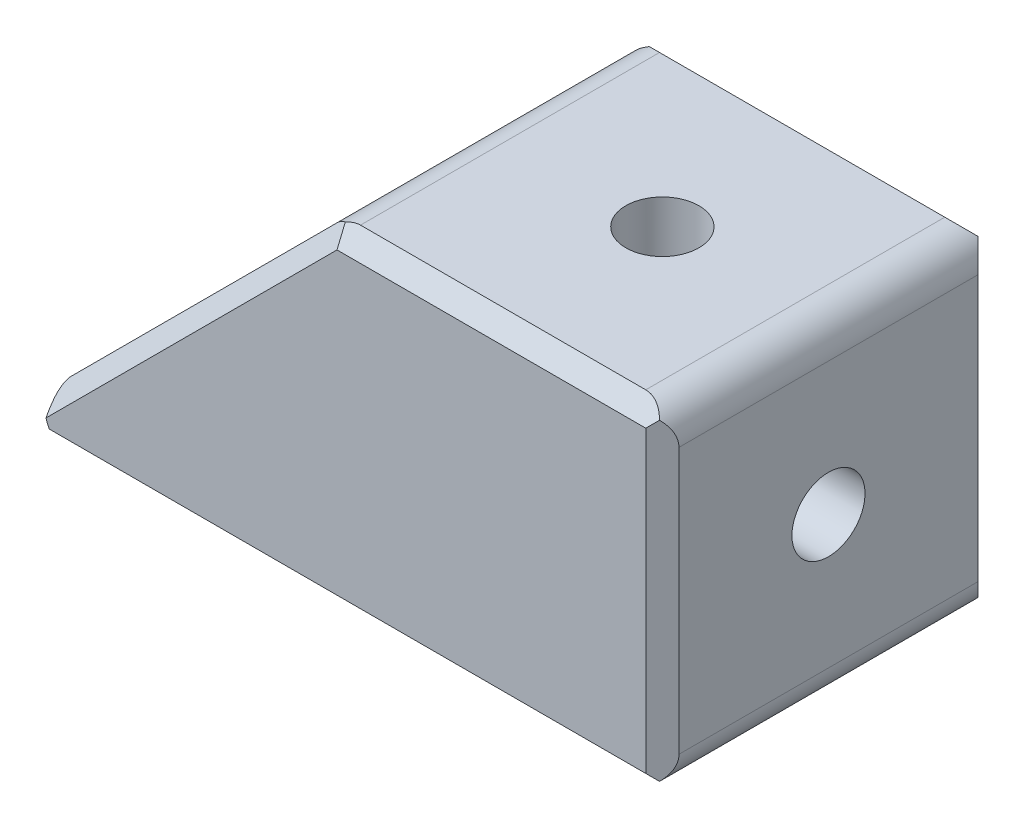
ISO-10303-21;
HEADER;
FILE_DESCRIPTION(('STEP AP214'),'2;1');
FILE_NAME('part.step','',(''),(''),'','','');
FILE_SCHEMA(('AUTOMOTIVE_DESIGN { 1 0 10303 214 1 1 1 1 }'));
ENDSEC;
DATA;
#1=APPLICATION_CONTEXT('core data for automotive mechanical design processes');
#2=APPLICATION_PROTOCOL_DEFINITION('international standard','automotive_design',2000,#1);
#3=PRODUCT_CONTEXT('',#1,'mechanical');
#4=PRODUCT('Part','Part','',(#3));
#5=PRODUCT_RELATED_PRODUCT_CATEGORY('part','',(#4));
#6=PRODUCT_DEFINITION_FORMATION('','',#4);
#7=PRODUCT_DEFINITION_CONTEXT('part definition',#1,'design');
#8=PRODUCT_DEFINITION('design','',#6,#7);
#9=PRODUCT_DEFINITION_SHAPE('','',#8);
#10=(LENGTH_UNIT() NAMED_UNIT(*) SI_UNIT(.MILLI.,.METRE.));
#11=(NAMED_UNIT(*) PLANE_ANGLE_UNIT() SI_UNIT($,.RADIAN.));
#12=(NAMED_UNIT(*) SI_UNIT($,.STERADIAN.) SOLID_ANGLE_UNIT());
#13=UNCERTAINTY_MEASURE_WITH_UNIT(LENGTH_MEASURE(1.E-05),#10,'distance_accuracy_value','');
#14=(GEOMETRIC_REPRESENTATION_CONTEXT(3) GLOBAL_UNCERTAINTY_ASSIGNED_CONTEXT((#13)) GLOBAL_UNIT_ASSIGNED_CONTEXT((#10,
#11,#12)) REPRESENTATION_CONTEXT('',''));
#15=CARTESIAN_POINT('',(0.,0.,0.));
#16=DIRECTION('',(0.,0.,1.));
#17=DIRECTION('',(1.,0.,0.));
#18=AXIS2_PLACEMENT_3D('',#15,#16,#17);
#19=CARTESIAN_POINT('',(0.,10.,10.));
#20=DIRECTION('',(-1.,0.,0.));
#21=DIRECTION('',(0.,0.,1.));
#22=AXIS2_PLACEMENT_3D('',#19,#20,#21);
#23=CYLINDRICAL_SURFACE('',#22,2.2);
#24=CARTESIAN_POINT('',(10.,10.,10.));
#25=DIRECTION('',(-0.707106781186547,0.707106781186547,0.));
#26=DIRECTION('',(-0.707106781186547,-0.707106781186547,0.));
#27=AXIS2_PLACEMENT_3D('',#24,#25,#26);
#28=ELLIPSE('',#27,3.1112698372208,2.2);
#29=CARTESIAN_POINT('',(10.,10.,12.2));
#30=VERTEX_POINT('',#29);
#31=CARTESIAN_POINT('',(10.,10.,7.8));
#32=VERTEX_POINT('',#31);
#33=EDGE_CURVE('E163',#30,#32,#28,.T.);
#34=ORIENTED_EDGE('',*,*,#33,.T.);
#35=CARTESIAN_POINT('',(10.,10.,10.));
#36=DIRECTION('',(-0.707106781186547,-0.707106781186547,0.));
#37=DIRECTION('',(-0.707106781186547,0.707106781186547,0.));
#38=AXIS2_PLACEMENT_3D('',#35,#36,#37);
#39=ELLIPSE('',#38,3.1112698372208,2.2);
#40=EDGE_CURVE('E170',#32,#30,#39,.T.);
#41=ORIENTED_EDGE('',*,*,#40,.T.);
#42=EDGE_LOOP('',(#34,#41));
#43=FACE_BOUND('',#42,.T.);
#44=CARTESIAN_POINT('',(30.,10.,10.));
#45=DIRECTION('',(-0.707106781186547,0.707106781186547,0.));
#46=DIRECTION('',(-0.707106781186547,-0.707106781186547,0.));
#47=AXIS2_PLACEMENT_3D('',#44,#45,#46);
#48=ELLIPSE('',#47,3.1112698372208,2.19999999999999);
#49=CARTESIAN_POINT('',(30.,10.,12.2));
#50=VERTEX_POINT('',#49);
#51=CARTESIAN_POINT('',(30.,10.,7.80000000000001));
#52=VERTEX_POINT('',#51);
#53=EDGE_CURVE('E399',#50,#52,#48,.F.);
#54=ORIENTED_EDGE('',*,*,#53,.T.);
#55=CARTESIAN_POINT('',(30.,10.,10.));
#56=DIRECTION('',(-0.707106781186547,-0.707106781186547,0.));
#57=DIRECTION('',(-0.707106781186547,0.707106781186547,0.));
#58=AXIS2_PLACEMENT_3D('',#55,#56,#57);
#59=ELLIPSE('',#58,3.1112698372208,2.19999999999999);
#60=EDGE_CURVE('E174',#52,#50,#59,.F.);
#61=ORIENTED_EDGE('',*,*,#60,.T.);
#62=EDGE_LOOP('',(#54,#61));
#63=FACE_BOUND('',#62,.T.);
#64=ADVANCED_FACE('F39',(#43,#63),#23,.F.);
#65=CARTESIAN_POINT('',(0.,0.,20.));
#66=DIRECTION('',(0.,1.,0.));
#67=DIRECTION('',(0.,0.,1.));
#68=AXIS2_PLACEMENT_3D('',#65,#66,#67);
#69=PLANE('',#68);
#70=CARTESIAN_POINT('',(10.,0.,10.));
#71=DIRECTION('',(0.,-1.,0.));
#72=DIRECTION('',(0.,0.,-1.));
#73=AXIS2_PLACEMENT_3D('',#70,#71,#72);
#74=CIRCLE('',#73,2.2);
#75=CARTESIAN_POINT('',(10.,0.,7.8));
#76=VERTEX_POINT('',#75);
#77=EDGE_CURVE('E232',#76,#76,#74,.T.);
#78=ORIENTED_EDGE('',*,*,#77,.F.);
#79=EDGE_LOOP('',(#78));
#80=FACE_BOUND('',#79,.T.);
#81=CARTESIAN_POINT('',(30.,0.,10.));
#82=DIRECTION('',(0.,-1.,0.));
#83=DIRECTION('',(0.,0.,-1.));
#84=AXIS2_PLACEMENT_3D('',#81,#82,#83);
#85=CIRCLE('',#84,2.19999999999999);
#86=CARTESIAN_POINT('',(30.,0.,7.80000000000001));
#87=VERTEX_POINT('',#86);
#88=EDGE_CURVE('E404',#87,#87,#85,.T.);
#89=ORIENTED_EDGE('',*,*,#88,.F.);
#90=EDGE_LOOP('',(#89));
#91=FACE_BOUND('',#90,.T.);
#92=DIRECTION('',(-1.,0.,0.));
#93=VECTOR('',#92,1.);
#94=CARTESIAN_POINT('',(0.,0.,19.));
#95=LINE('',#94,#93);
#96=CARTESIAN_POINT('',(38.,0.,19.));
#97=VERTEX_POINT('',#96);
#98=CARTESIAN_POINT('',(4.82842712474619,0.,19.));
#99=VERTEX_POINT('',#98);
#100=EDGE_CURVE('E177',#97,#99,#95,.T.);
#101=ORIENTED_EDGE('',*,*,#100,.T.);
#102=DIRECTION('',(0.,0.,-1.));
#103=VECTOR('',#102,1.);
#104=CARTESIAN_POINT('',(4.82842712474619,0.,20.));
#105=LINE('',#104,#103);
#106=CARTESIAN_POINT('',(4.82842712474619,0.,1.00000000000001));
#107=VERTEX_POINT('',#106);
#108=EDGE_CURVE('E240',#99,#107,#105,.T.);
#109=ORIENTED_EDGE('',*,*,#108,.T.);
#110=DIRECTION('',(1.,0.,0.));
#111=VECTOR('',#110,1.);
#112=CARTESIAN_POINT('',(40.,0.,1.00000000000001));
#113=LINE('',#112,#111);
#114=CARTESIAN_POINT('',(38.,0.,1.00000000000001));
#115=VERTEX_POINT('',#114);
#116=EDGE_CURVE('E180',#107,#115,#113,.T.);
#117=ORIENTED_EDGE('',*,*,#116,.T.);
#118=DIRECTION('',(0.,0.,-1.));
#119=VECTOR('',#118,1.);
#120=CARTESIAN_POINT('',(38.,0.,20.));
#121=LINE('',#120,#119);
#122=EDGE_CURVE('E222',#115,#97,#121,.F.);
#123=ORIENTED_EDGE('',*,*,#122,.T.);
#124=EDGE_LOOP('',(#101,#109,#117,#123));
#125=FACE_BOUND('',#124,.T.);
#126=ADVANCED_FACE('F325',(#80,#91,#125),#69,.F.);
#127=CARTESIAN_POINT('',(40.,0.,20.));
#128=DIRECTION('',(-1.,0.,0.));
#129=DIRECTION('',(0.,0.,1.));
#130=AXIS2_PLACEMENT_3D('',#127,#128,#129);
#131=PLANE('',#130);
#132=CARTESIAN_POINT('',(40.,10.,10.));
#133=DIRECTION('',(-1.,0.,0.));
#134=DIRECTION('',(0.,0.,1.));
#135=AXIS2_PLACEMENT_3D('',#132,#133,#134);
#136=CIRCLE('',#135,2.19999999999999);
#137=CARTESIAN_POINT('',(40.,10.,12.2));
#138=VERTEX_POINT('',#137);
#139=EDGE_CURVE('E397',#138,#138,#136,.T.);
#140=ORIENTED_EDGE('',*,*,#139,.T.);
#141=EDGE_LOOP('',(#140));
#142=FACE_BOUND('',#141,.T.);
#143=DIRECTION('',(0.,1.,0.));
#144=VECTOR('',#143,1.);
#145=CARTESIAN_POINT('',(40.,20.,1.00000000000001));
#146=LINE('',#145,#144);
#147=CARTESIAN_POINT('',(40.,2.,1.00000000000001));
#148=VERTEX_POINT('',#147);
#149=CARTESIAN_POINT('',(40.,18.,1.00000000000001));
#150=VERTEX_POINT('',#149);
#151=EDGE_CURVE('E197',#148,#150,#146,.T.);
#152=ORIENTED_EDGE('',*,*,#151,.T.);
#153=DIRECTION('',(0.,0.,-1.));
#154=VECTOR('',#153,1.);
#155=CARTESIAN_POINT('',(40.,18.,20.));
#156=LINE('',#155,#154);
#157=CARTESIAN_POINT('',(40.,18.,19.));
#158=VERTEX_POINT('',#157);
#159=EDGE_CURVE('E60',#150,#158,#156,.F.);
#160=ORIENTED_EDGE('',*,*,#159,.T.);
#161=DIRECTION('',(0.,-1.,0.));
#162=VECTOR('',#161,1.);
#163=CARTESIAN_POINT('',(40.,0.,19.));
#164=LINE('',#163,#162);
#165=CARTESIAN_POINT('',(40.,2.,19.));
#166=VERTEX_POINT('',#165);
#167=EDGE_CURVE('E195',#158,#166,#164,.T.);
#168=ORIENTED_EDGE('',*,*,#167,.T.);
#169=DIRECTION('',(0.,0.,-1.));
#170=VECTOR('',#169,1.);
#171=CARTESIAN_POINT('',(40.,2.,20.));
#172=LINE('',#171,#170);
#173=EDGE_CURVE('E285',#166,#148,#172,.T.);
#174=ORIENTED_EDGE('',*,*,#173,.T.);
#175=EDGE_LOOP('',(#152,#160,#168,#174));
#176=FACE_BOUND('',#175,.T.);
#177=ADVANCED_FACE('F290',(#142,#176),#131,.F.);
#178=CARTESIAN_POINT('',(0.,20.,20.));
#179=DIRECTION('',(0.,-1.,0.));
#180=DIRECTION('',(0.,0.,-1.));
#181=AXIS2_PLACEMENT_3D('',#178,#179,#180);
#182=PLANE('',#181);
#183=CARTESIAN_POINT('',(30.,20.,10.));
#184=DIRECTION('',(0.,-1.,0.));
#185=DIRECTION('',(0.,0.,-1.));
#186=AXIS2_PLACEMENT_3D('',#183,#184,#185);
#187=CIRCLE('',#186,2.19999999999999);
#188=CARTESIAN_POINT('',(30.,20.,7.8));
#189=VERTEX_POINT('',#188);
#190=EDGE_CURVE('E400',#189,#189,#187,.T.);
#191=ORIENTED_EDGE('',*,*,#190,.T.);
#192=EDGE_LOOP('',(#191));
#193=FACE_BOUND('',#192,.T.);
#194=DIRECTION('',(-1.,0.,0.));
#195=VECTOR('',#194,1.);
#196=CARTESIAN_POINT('',(20.,20.,1.00000000000001));
#197=LINE('',#196,#195);
#198=CARTESIAN_POINT('',(38.,20.,1.00000000000001));
#199=VERTEX_POINT('',#198);
#200=CARTESIAN_POINT('',(20.8284271247462,20.,1.00000000000001));
#201=VERTEX_POINT('',#200);
#202=EDGE_CURVE('E202',#199,#201,#197,.T.);
#203=ORIENTED_EDGE('',*,*,#202,.T.);
#204=DIRECTION('',(0.,0.,-1.));
#205=VECTOR('',#204,1.);
#206=CARTESIAN_POINT('',(20.8284271247462,20.,20.));
#207=LINE('',#206,#205);
#208=CARTESIAN_POINT('',(20.8284271247462,20.,19.));
#209=VERTEX_POINT('',#208);
#210=EDGE_CURVE('E275',#201,#209,#207,.F.);
#211=ORIENTED_EDGE('',*,*,#210,.T.);
#212=DIRECTION('',(1.,0.,0.));
#213=VECTOR('',#212,1.);
#214=CARTESIAN_POINT('',(0.,20.,19.));
#215=LINE('',#214,#213);
#216=CARTESIAN_POINT('',(38.,20.,19.));
#217=VERTEX_POINT('',#216);
#218=EDGE_CURVE('E199',#209,#217,#215,.T.);
#219=ORIENTED_EDGE('',*,*,#218,.T.);
#220=DIRECTION('',(0.,0.,-1.));
#221=VECTOR('',#220,1.);
#222=CARTESIAN_POINT('',(38.,20.,20.));
#223=LINE('',#222,#221);
#224=EDGE_CURVE('E272',#217,#199,#223,.T.);
#225=ORIENTED_EDGE('',*,*,#224,.T.);
#226=EDGE_LOOP('',(#203,#211,#219,#225));
#227=FACE_BOUND('',#226,.T.);
#228=ADVANCED_FACE('F346',(#193,#227),#182,.F.);
#229=CARTESIAN_POINT('',(0.,0.,20.));
#230=DIRECTION('',(0.,0.,-1.));
#231=DIRECTION('',(-1.,0.,0.));
#232=AXIS2_PLACEMENT_3D('',#229,#230,#231);
#233=PLANE('',#232);
#234=DIRECTION('',(-0.707106781186548,-0.707106781186548,0.));
#235=VECTOR('',#234,1.);
#236=CARTESIAN_POINT('',(0.707106781186548,-0.707106781186548,20.));
#237=LINE('',#236,#235);
#238=CARTESIAN_POINT('',(20.4142135623731,19.,20.));
#239=VERTEX_POINT('',#238);
#240=CARTESIAN_POINT('',(2.89657547216805,1.48236190979496,20.));
#241=VERTEX_POINT('',#240);
#242=EDGE_CURVE('E211',#239,#241,#237,.T.);
#243=ORIENTED_EDGE('',*,*,#242,.T.);
#244=CARTESIAN_POINT('',(4.82842712474619,2.,20.));
#245=DIRECTION('',(0.,0.,-1.));
#246=DIRECTION('',(-1.,0.,0.));
#247=AXIS2_PLACEMENT_3D('',#244,#245,#246);
#248=CIRCLE('',#247,2.);
#249=CARTESIAN_POINT('',(3.09637631717731,1.,20.));
#250=VERTEX_POINT('',#249);
#251=EDGE_CURVE('E262',#241,#250,#248,.F.);
#252=ORIENTED_EDGE('',*,*,#251,.T.);
#253=DIRECTION('',(1.,0.,0.));
#254=VECTOR('',#253,1.);
#255=CARTESIAN_POINT('',(0.,1.,20.));
#256=LINE('',#255,#254);
#257=CARTESIAN_POINT('',(39.,1.,20.));
#258=VERTEX_POINT('',#257);
#259=EDGE_CURVE('E219',#250,#258,#256,.T.);
#260=ORIENTED_EDGE('',*,*,#259,.T.);
#261=DIRECTION('',(0.,1.,0.));
#262=VECTOR('',#261,1.);
#263=CARTESIAN_POINT('',(39.,0.,20.));
#264=LINE('',#263,#262);
#265=CARTESIAN_POINT('',(39.,19.,20.));
#266=VERTEX_POINT('',#265);
#267=EDGE_CURVE('E216',#258,#266,#264,.T.);
#268=ORIENTED_EDGE('',*,*,#267,.T.);
#269=DIRECTION('',(-1.,0.,0.));
#270=VECTOR('',#269,1.);
#271=CARTESIAN_POINT('',(0.,19.,20.));
#272=LINE('',#271,#270);
#273=EDGE_CURVE('E214',#266,#239,#272,.T.);
#274=ORIENTED_EDGE('',*,*,#273,.T.);
#275=EDGE_LOOP('',(#243,#252,#260,#268,#274));
#276=FACE_BOUND('',#275,.T.);
#277=ADVANCED_FACE('F313',(#276),#233,.F.);
#278=CARTESIAN_POINT('',(0.,0.,0.));
#279=DIRECTION('',(0.,0.,-1.));
#280=DIRECTION('',(-1.,0.,0.));
#281=AXIS2_PLACEMENT_3D('',#278,#279,#280);
#282=PLANE('',#281);
#283=DIRECTION('',(-1.,0.,0.));
#284=VECTOR('',#283,1.);
#285=CARTESIAN_POINT('',(0.,1.00000000000002,0.));
#286=LINE('',#285,#284);
#287=CARTESIAN_POINT('',(39.,1.00000000000002,0.));
#288=VERTEX_POINT('',#287);
#289=CARTESIAN_POINT('',(3.0963763171773,1.00000000000002,0.));
#290=VERTEX_POINT('',#289);
#291=EDGE_CURVE('E192',#288,#290,#286,.T.);
#292=ORIENTED_EDGE('',*,*,#291,.T.);
#293=CARTESIAN_POINT('',(4.82842712474619,2.,0.));
#294=DIRECTION('',(0.,0.,-1.));
#295=DIRECTION('',(-1.,0.,0.));
#296=AXIS2_PLACEMENT_3D('',#293,#294,#295);
#297=CIRCLE('',#296,2.);
#298=CARTESIAN_POINT('',(2.89657547216806,1.48236190979494,0.));
#299=VERTEX_POINT('',#298);
#300=EDGE_CURVE('E247',#290,#299,#297,.T.);
#301=ORIENTED_EDGE('',*,*,#300,.T.);
#302=DIRECTION('',(0.707106781186548,0.707106781186548,0.));
#303=VECTOR('',#302,1.);
#304=CARTESIAN_POINT('',(20.7071067811866,19.2928932188134,0.));
#305=LINE('',#304,#303);
#306=CARTESIAN_POINT('',(20.4142135623731,19.,0.));
#307=VERTEX_POINT('',#306);
#308=EDGE_CURVE('E185',#299,#307,#305,.T.);
#309=ORIENTED_EDGE('',*,*,#308,.T.);
#310=DIRECTION('',(1.,0.,0.));
#311=VECTOR('',#310,1.);
#312=CARTESIAN_POINT('',(40.,19.,0.));
#313=LINE('',#312,#311);
#314=CARTESIAN_POINT('',(39.,19.,0.));
#315=VERTEX_POINT('',#314);
#316=EDGE_CURVE('E188',#307,#315,#313,.T.);
#317=ORIENTED_EDGE('',*,*,#316,.T.);
#318=DIRECTION('',(0.,-1.,0.));
#319=VECTOR('',#318,1.);
#320=CARTESIAN_POINT('',(39.,0.,0.));
#321=LINE('',#320,#319);
#322=EDGE_CURVE('E190',#315,#288,#321,.T.);
#323=ORIENTED_EDGE('',*,*,#322,.T.);
#324=EDGE_LOOP('',(#292,#301,#309,#317,#323));
#325=FACE_BOUND('',#324,.T.);
#326=ADVANCED_FACE('F336',(#325),#282,.T.);
#327=CARTESIAN_POINT('',(30.,10.,10.));
#328=DIRECTION('',(-0.707106781186547,0.707106781186547,0.));
#329=DIRECTION('',(-0.707106781186547,-0.707106781186547,0.));
#330=AXIS2_PLACEMENT_3D('',#327,#328,#329);
#331=ELLIPSE('',#330,3.1112698372208,2.19999999999999);
#332=EDGE_CURVE('E394',#50,#52,#331,.T.);
#333=ORIENTED_EDGE('',*,*,#332,.T.);
#334=CARTESIAN_POINT('',(30.,10.,10.));
#335=DIRECTION('',(-0.707106781186547,-0.707106781186547,0.));
#336=DIRECTION('',(-0.707106781186547,0.707106781186547,0.));
#337=AXIS2_PLACEMENT_3D('',#334,#335,#336);
#338=ELLIPSE('',#337,3.1112698372208,2.19999999999999);
#339=EDGE_CURVE('E409',#52,#50,#338,.T.);
#340=ORIENTED_EDGE('',*,*,#339,.T.);
#341=EDGE_LOOP('',(#333,#340));
#342=FACE_BOUND('',#341,.T.);
#343=ORIENTED_EDGE('',*,*,#139,.F.);
#344=EDGE_LOOP('',(#343));
#345=FACE_BOUND('',#344,.T.);
#346=ADVANCED_FACE('F371',(#342,#345),#23,.F.);
#347=CARTESIAN_POINT('',(30.,0.,10.));
#348=DIRECTION('',(0.,-1.,0.));
#349=DIRECTION('',(0.,0.,-1.));
#350=AXIS2_PLACEMENT_3D('',#347,#348,#349);
#351=CYLINDRICAL_SURFACE('',#350,2.19999999999999);
#352=ORIENTED_EDGE('',*,*,#88,.T.);
#353=EDGE_LOOP('',(#352));
#354=FACE_BOUND('',#353,.T.);
#355=ORIENTED_EDGE('',*,*,#53,.F.);
#356=ORIENTED_EDGE('',*,*,#339,.F.);
#357=EDGE_LOOP('',(#355,#356));
#358=FACE_BOUND('',#357,.T.);
#359=ADVANCED_FACE('F382',(#354,#358),#351,.F.);
#360=ORIENTED_EDGE('',*,*,#190,.F.);
#361=EDGE_LOOP('',(#360));
#362=FACE_BOUND('',#361,.T.);
#363=ORIENTED_EDGE('',*,*,#332,.F.);
#364=ORIENTED_EDGE('',*,*,#60,.F.);
#365=EDGE_LOOP('',(#363,#364));
#366=FACE_BOUND('',#365,.T.);
#367=ADVANCED_FACE('F387',(#362,#366),#351,.F.);
#368=CARTESIAN_POINT('',(10.,0.,10.));
#369=DIRECTION('',(0.,-1.,0.));
#370=DIRECTION('',(0.,0.,-1.));
#371=AXIS2_PLACEMENT_3D('',#368,#369,#370);
#372=CYLINDRICAL_SURFACE('',#371,2.2);
#373=ORIENTED_EDGE('',*,*,#77,.T.);
#374=EDGE_LOOP('',(#373));
#375=FACE_BOUND('',#374,.T.);
#376=CARTESIAN_POINT('',(10.,10.,10.));
#377=DIRECTION('',(-0.707106781186547,0.707106781186547,0.));
#378=DIRECTION('',(-0.707106781186547,-0.707106781186547,0.));
#379=AXIS2_PLACEMENT_3D('',#376,#377,#378);
#380=ELLIPSE('',#379,3.1112698372208,2.2);
#381=EDGE_CURVE('E166',#30,#32,#380,.F.);
#382=ORIENTED_EDGE('',*,*,#381,.F.);
#383=ORIENTED_EDGE('',*,*,#40,.F.);
#384=EDGE_LOOP('',(#382,#383));
#385=FACE_BOUND('',#384,.T.);
#386=ADVANCED_FACE('F173',(#375,#385),#372,.F.);
#387=CARTESIAN_POINT('',(0.,0.,20.));
#388=DIRECTION('',(0.707106781186548,-0.707106781186548,0.));
#389=DIRECTION('',(0.707106781186548,0.707106781186548,0.));
#390=AXIS2_PLACEMENT_3D('',#387,#388,#389);
#391=PLANE('',#390);
#392=DIRECTION('',(-0.707106781186548,-0.707106781186548,0.));
#393=VECTOR('',#392,1.);
#394=CARTESIAN_POINT('',(0.,0.,1.00000000000001));
#395=LINE('',#394,#393);
#396=CARTESIAN_POINT('',(19.4142135623731,19.4142135623731,1.00000000000001));
#397=VERTEX_POINT('',#396);
#398=CARTESIAN_POINT('',(3.4142135623731,3.4142135623731,1.00000000000001));
#399=VERTEX_POINT('',#398);
#400=EDGE_CURVE('E208',#397,#399,#395,.T.);
#401=ORIENTED_EDGE('',*,*,#400,.T.);
#402=DIRECTION('',(0.,0.,-1.));
#403=VECTOR('',#402,1.);
#404=CARTESIAN_POINT('',(3.41421356237309,3.41421356237309,20.));
#405=LINE('',#404,#403);
#406=CARTESIAN_POINT('',(3.4142135623731,3.4142135623731,19.));
#407=VERTEX_POINT('',#406);
#408=EDGE_CURVE('E256',#399,#407,#405,.F.);
#409=ORIENTED_EDGE('',*,*,#408,.T.);
#410=DIRECTION('',(0.707106781186548,0.707106781186548,0.));
#411=VECTOR('',#410,1.);
#412=CARTESIAN_POINT('',(0.,0.,19.));
#413=LINE('',#412,#411);
#414=CARTESIAN_POINT('',(19.4142135623731,19.4142135623731,19.));
#415=VERTEX_POINT('',#414);
#416=EDGE_CURVE('E205',#407,#415,#413,.T.);
#417=ORIENTED_EDGE('',*,*,#416,.T.);
#418=DIRECTION('',(0.,0.,-1.));
#419=VECTOR('',#418,1.);
#420=CARTESIAN_POINT('',(19.4142135623731,19.4142135623731,20.));
#421=LINE('',#420,#419);
#422=EDGE_CURVE('E253',#415,#397,#421,.T.);
#423=ORIENTED_EDGE('',*,*,#422,.T.);
#424=EDGE_LOOP('',(#401,#409,#417,#423));
#425=FACE_BOUND('',#424,.T.);
#426=ORIENTED_EDGE('',*,*,#33,.F.);
#427=ORIENTED_EDGE('',*,*,#381,.T.);
#428=EDGE_LOOP('',(#426,#427));
#429=FACE_BOUND('',#428,.T.);
#430=ADVANCED_FACE('F165',(#425,#429),#391,.F.);
#431=CARTESIAN_POINT('',(0.,20.,1.00000000000001));
#432=DIRECTION('',(0.,0.707106781186547,-0.707106781186547));
#433=DIRECTION('',(1.,0.,0.));
#434=AXIS2_PLACEMENT_3D('',#431,#432,#433);
#435=PLANE('',#434);
#436=DIRECTION('',(0.281084637714822,-0.678598344545847,-0.678598344545847));
#437=VECTOR('',#436,1.);
#438=CARTESIAN_POINT('',(22.2346999254255,14.6049571322037,-4.39504286779631));
#439=LINE('',#438,#437);
#440=CARTESIAN_POINT('',(20.063060260016,19.8477590650226,0.84775906502259));
#441=VERTEX_POINT('',#440);
#442=EDGE_CURVE('E230',#441,#307,#439,.T.);
#443=ORIENTED_EDGE('',*,*,#442,.F.);
#444=CARTESIAN_POINT('',(20.8284271247462,18.,-0.999999999999984));
#445=DIRECTION('',(0.,0.707106781186547,-0.707106781186547));
#446=DIRECTION('',(0.,-0.707106781186548,-0.707106781186548));
#447=AXIS2_PLACEMENT_3D('',#444,#445,#446);
#448=ELLIPSE('',#447,2.82842712474619,2.);
#449=EDGE_CURVE('E270',#441,#201,#448,.T.);
#450=ORIENTED_EDGE('',*,*,#449,.T.);
#451=ORIENTED_EDGE('',*,*,#202,.F.);
#452=CARTESIAN_POINT('',(38.,18.,-0.999999999999984));
#453=DIRECTION('',(0.,0.707106781186547,-0.707106781186547));
#454=DIRECTION('',(0.,-0.707106781186548,-0.707106781186548));
#455=AXIS2_PLACEMENT_3D('',#452,#453,#454);
#456=ELLIPSE('',#455,2.82842712474619,2.);
#457=CARTESIAN_POINT('',(39.4142135623731,19.4142135623731,0.414213562373112));
#458=VERTEX_POINT('',#457);
#459=EDGE_CURVE('E268',#199,#458,#456,.T.);
#460=ORIENTED_EDGE('',*,*,#459,.T.);
#461=DIRECTION('',(-0.577350269189626,-0.577350269189626,-0.577350269189626));
#462=VECTOR('',#461,1.);
#463=CARTESIAN_POINT('',(26.6666666666667,6.66666666666667,-12.3333333333333));
#464=LINE('',#463,#462);
#465=EDGE_CURVE('E226',#315,#458,#464,.F.);
#466=ORIENTED_EDGE('',*,*,#465,.F.);
#467=ORIENTED_EDGE('',*,*,#316,.F.);
#468=EDGE_LOOP('',(#443,#450,#451,#460,#466,#467));
#469=FACE_BOUND('',#468,.T.);
#470=ADVANCED_FACE('F341',(#469),#435,.T.);
#471=CARTESIAN_POINT('',(0.,0.,1.00000000000001));
#472=DIRECTION('',(-0.5,0.5,-0.707106781186548));
#473=DIRECTION('',(0.707106781186548,0.707106781186548,0.));
#474=AXIS2_PLACEMENT_3D('',#471,#472,#473);
#475=PLANE('',#474);
#476=ORIENTED_EDGE('',*,*,#308,.F.);
#477=CARTESIAN_POINT('',(4.82842712474619,2.,-0.99999999999998));
#478=DIRECTION('',(-0.5,0.5,-0.707106781186548));
#479=DIRECTION('',(0.500000000000001,-0.500000000000001,-0.707106781186547));
#480=AXIS2_PLACEMENT_3D('',#477,#478,#479);
#481=ELLIPSE('',#480,2.82842712474619,2.);
#482=EDGE_CURVE('E251',#299,#399,#481,.T.);
#483=ORIENTED_EDGE('',*,*,#482,.T.);
#484=ORIENTED_EDGE('',*,*,#400,.F.);
#485=CARTESIAN_POINT('',(20.8284271247462,18.,-0.999999999999984));
#486=DIRECTION('',(-0.5,0.5,-0.707106781186548));
#487=DIRECTION('',(0.500000000000001,-0.500000000000001,-0.707106781186547));
#488=AXIS2_PLACEMENT_3D('',#485,#486,#487);
#489=ELLIPSE('',#488,2.82842712474619,2.);
#490=EDGE_CURVE('E249',#397,#441,#489,.T.);
#491=ORIENTED_EDGE('',*,*,#490,.T.);
#492=ORIENTED_EDGE('',*,*,#442,.T.);
#493=EDGE_LOOP('',(#476,#483,#484,#491,#492));
#494=FACE_BOUND('',#493,.T.);
#495=ADVANCED_FACE('F359',(#494),#475,.T.);
#496=CARTESIAN_POINT('',(40.,0.,1.00000000000001));
#497=DIRECTION('',(0.707106781186547,0.,-0.707106781186547));
#498=DIRECTION('',(0.,-1.,0.));
#499=AXIS2_PLACEMENT_3D('',#496,#497,#498);
#500=PLANE('',#499);
#501=ORIENTED_EDGE('',*,*,#465,.T.);
#502=CARTESIAN_POINT('',(38.,18.,-0.999999999999987));
#503=DIRECTION('',(0.707106781186547,0.,-0.707106781186547));
#504=DIRECTION('',(-0.707106781186548,0.,-0.707106781186548));
#505=AXIS2_PLACEMENT_3D('',#502,#503,#504);
#506=ELLIPSE('',#505,2.82842712474619,2.);
#507=EDGE_CURVE('E283',#458,#150,#506,.T.);
#508=ORIENTED_EDGE('',*,*,#507,.T.);
#509=ORIENTED_EDGE('',*,*,#151,.F.);
#510=CARTESIAN_POINT('',(38.,2.,-0.999999999999987));
#511=DIRECTION('',(0.707106781186547,0.,-0.707106781186547));
#512=DIRECTION('',(-0.707106781186548,0.,-0.707106781186548));
#513=AXIS2_PLACEMENT_3D('',#510,#511,#512);
#514=ELLIPSE('',#513,2.82842712474619,2.);
#515=CARTESIAN_POINT('',(39.4142135623731,0.585786437626906,0.414213562373109));
#516=VERTEX_POINT('',#515);
#517=EDGE_CURVE('E281',#148,#516,#514,.T.);
#518=ORIENTED_EDGE('',*,*,#517,.T.);
#519=DIRECTION('',(-0.577350269189626,0.577350269189626,-0.577350269189626));
#520=VECTOR('',#519,1.);
#521=CARTESIAN_POINT('',(40.,0.,1.00000000000001));
#522=LINE('',#521,#520);
#523=EDGE_CURVE('E223',#288,#516,#522,.F.);
#524=ORIENTED_EDGE('',*,*,#523,.F.);
#525=ORIENTED_EDGE('',*,*,#322,.F.);
#526=EDGE_LOOP('',(#501,#508,#509,#518,#524,#525));
#527=FACE_BOUND('',#526,.T.);
#528=ADVANCED_FACE('F293',(#527),#500,.T.);
#529=CARTESIAN_POINT('',(0.,0.,1.00000000000001));
#530=DIRECTION('',(0.,-0.707106781186547,-0.707106781186548));
#531=DIRECTION('',(-1.,0.,0.));
#532=AXIS2_PLACEMENT_3D('',#529,#530,#531);
#533=PLANE('',#532);
#534=ORIENTED_EDGE('',*,*,#116,.F.);
#535=CARTESIAN_POINT('',(4.82842712474619,2.,-0.999999999999984));
#536=DIRECTION('',(0.,-0.707106781186547,-0.707106781186548));
#537=DIRECTION('',(0.,0.707106781186548,-0.707106781186547));
#538=AXIS2_PLACEMENT_3D('',#535,#536,#537);
#539=ELLIPSE('',#538,2.82842712474619,2.);
#540=EDGE_CURVE('E245',#107,#290,#539,.T.);
#541=ORIENTED_EDGE('',*,*,#540,.T.);
#542=ORIENTED_EDGE('',*,*,#291,.F.);
#543=ORIENTED_EDGE('',*,*,#523,.T.);
#544=CARTESIAN_POINT('',(38.,2.,-0.999999999999984));
#545=DIRECTION('',(0.,-0.707106781186547,-0.707106781186548));
#546=DIRECTION('',(0.,0.707106781186548,-0.707106781186547));
#547=AXIS2_PLACEMENT_3D('',#544,#545,#546);
#548=ELLIPSE('',#547,2.82842712474619,2.);
#549=EDGE_CURVE('E243',#516,#115,#548,.T.);
#550=ORIENTED_EDGE('',*,*,#549,.T.);
#551=EDGE_LOOP('',(#534,#541,#542,#543,#550));
#552=FACE_BOUND('',#551,.T.);
#553=ADVANCED_FACE('F334',(#552),#533,.T.);
#554=CARTESIAN_POINT('',(0.,19.,20.));
#555=DIRECTION('',(0.,-0.707106781186547,-0.707106781186547));
#556=DIRECTION('',(-1.,0.,0.));
#557=AXIS2_PLACEMENT_3D('',#554,#555,#556);
#558=PLANE('',#557);
#559=ORIENTED_EDGE('',*,*,#218,.F.);
#560=CARTESIAN_POINT('',(20.8284271247462,18.,21.));
#561=DIRECTION('',(0.,-0.707106781186547,-0.707106781186547));
#562=DIRECTION('',(0.,0.707106781186548,-0.707106781186548));
#563=AXIS2_PLACEMENT_3D('',#560,#561,#562);
#564=ELLIPSE('',#563,2.82842712474619,2.);
#565=CARTESIAN_POINT('',(20.063060260016,19.8477590650226,19.1522409349774));
#566=VERTEX_POINT('',#565);
#567=EDGE_CURVE('E279',#209,#566,#564,.F.);
#568=ORIENTED_EDGE('',*,*,#567,.T.);
#569=DIRECTION('',(-0.28108463771482,0.678598344545847,-0.678598344545847));
#570=VECTOR('',#569,1.);
#571=CARTESIAN_POINT('',(22.6161870650866,13.6839657057629,25.3160342942371));
#572=LINE('',#571,#570);
#573=EDGE_CURVE('E227',#239,#566,#572,.T.);
#574=ORIENTED_EDGE('',*,*,#573,.F.);
#575=ORIENTED_EDGE('',*,*,#273,.F.);
#576=DIRECTION('',(0.577350269189626,0.577350269189626,-0.577350269189626));
#577=VECTOR('',#576,1.);
#578=CARTESIAN_POINT('',(26.,6.,33.));
#579=LINE('',#578,#577);
#580=CARTESIAN_POINT('',(39.4142135623731,19.4142135623731,19.5857864376269));
#581=VERTEX_POINT('',#580);
#582=EDGE_CURVE('E235',#581,#266,#579,.F.);
#583=ORIENTED_EDGE('',*,*,#582,.F.);
#584=CARTESIAN_POINT('',(38.,18.,21.));
#585=DIRECTION('',(0.,-0.707106781186547,-0.707106781186547));
#586=DIRECTION('',(0.,0.707106781186548,-0.707106781186548));
#587=AXIS2_PLACEMENT_3D('',#584,#585,#586);
#588=ELLIPSE('',#587,2.82842712474619,2.);
#589=EDGE_CURVE('E277',#581,#217,#588,.F.);
#590=ORIENTED_EDGE('',*,*,#589,.T.);
#591=EDGE_LOOP('',(#559,#568,#574,#575,#583,#590));
#592=FACE_BOUND('',#591,.T.);
#593=ADVANCED_FACE('F309',(#592),#558,.F.);
#594=CARTESIAN_POINT('',(0.707106781186548,-0.707106781186548,20.));
#595=DIRECTION('',(0.5,-0.5,-0.707106781186547));
#596=DIRECTION('',(-0.707106781186548,-0.707106781186548,0.));
#597=AXIS2_PLACEMENT_3D('',#594,#595,#596);
#598=PLANE('',#597);
#599=ORIENTED_EDGE('',*,*,#416,.F.);
#600=CARTESIAN_POINT('',(4.82842712474619,2.,21.));
#601=DIRECTION('',(0.5,-0.5,-0.707106781186547));
#602=DIRECTION('',(-0.5,0.5,-0.707106781186548));
#603=AXIS2_PLACEMENT_3D('',#600,#601,#602);
#604=ELLIPSE('',#603,2.82842712474619,2.);
#605=EDGE_CURVE('E260',#407,#241,#604,.F.);
#606=ORIENTED_EDGE('',*,*,#605,.T.);
#607=ORIENTED_EDGE('',*,*,#242,.F.);
#608=ORIENTED_EDGE('',*,*,#573,.T.);
#609=CARTESIAN_POINT('',(20.8284271247462,18.,21.));
#610=DIRECTION('',(0.5,-0.5,-0.707106781186547));
#611=DIRECTION('',(-0.5,0.5,-0.707106781186548));
#612=AXIS2_PLACEMENT_3D('',#609,#610,#611);
#613=ELLIPSE('',#612,2.82842712474619,2.);
#614=EDGE_CURVE('E258',#566,#415,#613,.F.);
#615=ORIENTED_EDGE('',*,*,#614,.T.);
#616=EDGE_LOOP('',(#599,#606,#607,#608,#615));
#617=FACE_BOUND('',#616,.T.);
#618=ADVANCED_FACE('F354',(#617),#598,.F.);
#619=CARTESIAN_POINT('',(39.,0.,20.));
#620=DIRECTION('',(-0.707106781186547,0.,-0.707106781186547));
#621=DIRECTION('',(0.,1.,0.));
#622=AXIS2_PLACEMENT_3D('',#619,#620,#621);
#623=PLANE('',#622);
#624=ORIENTED_EDGE('',*,*,#167,.F.);
#625=CARTESIAN_POINT('',(38.,18.,21.));
#626=DIRECTION('',(-0.707106781186547,0.,-0.707106781186547));
#627=DIRECTION('',(0.707106781186548,0.,-0.707106781186548));
#628=AXIS2_PLACEMENT_3D('',#625,#626,#627);
#629=ELLIPSE('',#628,2.82842712474619,2.);
#630=EDGE_CURVE('E11',#158,#581,#629,.F.);
#631=ORIENTED_EDGE('',*,*,#630,.T.);
#632=ORIENTED_EDGE('',*,*,#582,.T.);
#633=ORIENTED_EDGE('',*,*,#267,.F.);
#634=DIRECTION('',(0.577350269189626,-0.577350269189626,-0.577350269189626));
#635=VECTOR('',#634,1.);
#636=CARTESIAN_POINT('',(39.3333333333333,0.666666666666667,19.6666666666667));
#637=LINE('',#636,#635);
#638=CARTESIAN_POINT('',(39.4142135623731,0.585786437626904,19.5857864376269));
#639=VERTEX_POINT('',#638);
#640=EDGE_CURVE('E233',#639,#258,#637,.F.);
#641=ORIENTED_EDGE('',*,*,#640,.F.);
#642=CARTESIAN_POINT('',(38.,2.,21.));
#643=DIRECTION('',(-0.707106781186547,0.,-0.707106781186547));
#644=DIRECTION('',(0.707106781186548,0.,-0.707106781186548));
#645=AXIS2_PLACEMENT_3D('',#642,#643,#644);
#646=ELLIPSE('',#645,2.82842712474619,2.);
#647=EDGE_CURVE('E47',#639,#166,#646,.F.);
#648=ORIENTED_EDGE('',*,*,#647,.T.);
#649=EDGE_LOOP('',(#624,#631,#632,#633,#641,#648));
#650=FACE_BOUND('',#649,.T.);
#651=ADVANCED_FACE('F304',(#650),#623,.F.);
#652=CARTESIAN_POINT('',(0.,1.,20.));
#653=DIRECTION('',(0.,0.707106781186547,-0.707106781186548));
#654=DIRECTION('',(1.,0.,0.));
#655=AXIS2_PLACEMENT_3D('',#652,#653,#654);
#656=PLANE('',#655);
#657=ORIENTED_EDGE('',*,*,#259,.F.);
#658=CARTESIAN_POINT('',(4.82842712474619,2.,21.));
#659=DIRECTION('',(0.,0.707106781186547,-0.707106781186548));
#660=DIRECTION('',(0.,-0.707106781186548,-0.707106781186547));
#661=AXIS2_PLACEMENT_3D('',#658,#659,#660);
#662=ELLIPSE('',#661,2.82842712474619,2.);
#663=EDGE_CURVE('E266',#250,#99,#662,.F.);
#664=ORIENTED_EDGE('',*,*,#663,.T.);
#665=ORIENTED_EDGE('',*,*,#100,.F.);
#666=CARTESIAN_POINT('',(38.,2.,21.));
#667=DIRECTION('',(0.,0.707106781186547,-0.707106781186548));
#668=DIRECTION('',(0.,-0.707106781186548,-0.707106781186547));
#669=AXIS2_PLACEMENT_3D('',#666,#667,#668);
#670=ELLIPSE('',#669,2.82842712474619,2.);
#671=EDGE_CURVE('E264',#97,#639,#670,.F.);
#672=ORIENTED_EDGE('',*,*,#671,.T.);
#673=ORIENTED_EDGE('',*,*,#640,.T.);
#674=EDGE_LOOP('',(#657,#664,#665,#672,#673));
#675=FACE_BOUND('',#674,.T.);
#676=ADVANCED_FACE('F321',(#675),#656,.F.);
#677=CARTESIAN_POINT('',(4.82842712474619,2.,20.));
#678=DIRECTION('',(0.,0.,-1.));
#679=DIRECTION('',(-1.,0.,0.));
#680=AXIS2_PLACEMENT_3D('',#677,#678,#679);
#681=CYLINDRICAL_SURFACE('',#680,2.);
#682=ORIENTED_EDGE('',*,*,#605,.F.);
#683=ORIENTED_EDGE('',*,*,#408,.F.);
#684=ORIENTED_EDGE('',*,*,#482,.F.);
#685=ORIENTED_EDGE('',*,*,#300,.F.);
#686=ORIENTED_EDGE('',*,*,#540,.F.);
#687=ORIENTED_EDGE('',*,*,#108,.F.);
#688=ORIENTED_EDGE('',*,*,#663,.F.);
#689=ORIENTED_EDGE('',*,*,#251,.F.);
#690=EDGE_LOOP('',(#682,#683,#684,#685,#686,#687,#688,#689));
#691=FACE_BOUND('',#690,.T.);
#692=ADVANCED_FACE('F329',(#691),#681,.T.);
#693=CARTESIAN_POINT('',(20.8284271247462,18.,20.));
#694=DIRECTION('',(0.,0.,-1.));
#695=DIRECTION('',(-1.,0.,0.));
#696=AXIS2_PLACEMENT_3D('',#693,#694,#695);
#697=CYLINDRICAL_SURFACE('',#696,2.);
#698=ORIENTED_EDGE('',*,*,#567,.F.);
#699=ORIENTED_EDGE('',*,*,#210,.F.);
#700=ORIENTED_EDGE('',*,*,#449,.F.);
#701=ORIENTED_EDGE('',*,*,#490,.F.);
#702=ORIENTED_EDGE('',*,*,#422,.F.);
#703=ORIENTED_EDGE('',*,*,#614,.F.);
#704=EDGE_LOOP('',(#698,#699,#700,#701,#702,#703));
#705=FACE_BOUND('',#704,.T.);
#706=ADVANCED_FACE('F349',(#705),#697,.T.);
#707=CARTESIAN_POINT('',(38.,18.,20.));
#708=DIRECTION('',(0.,0.,-1.));
#709=DIRECTION('',(-1.,0.,0.));
#710=AXIS2_PLACEMENT_3D('',#707,#708,#709);
#711=CYLINDRICAL_SURFACE('',#710,2.);
#712=ORIENTED_EDGE('',*,*,#630,.F.);
#713=ORIENTED_EDGE('',*,*,#159,.F.);
#714=ORIENTED_EDGE('',*,*,#507,.F.);
#715=ORIENTED_EDGE('',*,*,#459,.F.);
#716=ORIENTED_EDGE('',*,*,#224,.F.);
#717=ORIENTED_EDGE('',*,*,#589,.F.);
#718=EDGE_LOOP('',(#712,#713,#714,#715,#716,#717));
#719=FACE_BOUND('',#718,.T.);
#720=ADVANCED_FACE('F300',(#719),#711,.T.);
#721=CARTESIAN_POINT('',(38.,2.,20.));
#722=DIRECTION('',(0.,0.,-1.));
#723=DIRECTION('',(-1.,0.,0.));
#724=AXIS2_PLACEMENT_3D('',#721,#722,#723);
#725=CYLINDRICAL_SURFACE('',#724,2.);
#726=ORIENTED_EDGE('',*,*,#671,.F.);
#727=ORIENTED_EDGE('',*,*,#122,.F.);
#728=ORIENTED_EDGE('',*,*,#549,.F.);
#729=ORIENTED_EDGE('',*,*,#517,.F.);
#730=ORIENTED_EDGE('',*,*,#173,.F.);
#731=ORIENTED_EDGE('',*,*,#647,.F.);
#732=EDGE_LOOP('',(#726,#727,#728,#729,#730,#731));
#733=FACE_BOUND('',#732,.T.);
#734=ADVANCED_FACE('F41',(#733),#725,.T.);
#735=CLOSED_SHELL('',(#64,#126,#177,#228,#277,#326,#346,#359,#367,#386,#430,#470,#495,#528,#553,
#593,#618,#651,#676,#692,#706,#720,#734));
#736=MANIFOLD_SOLID_BREP('B2',#735);
#737=ADVANCED_BREP_SHAPE_REPRESENTATION('',(#18,#736),#14);
#738=SHAPE_DEFINITION_REPRESENTATION(#9,#737);
ENDSEC;
END-ISO-10303-21;
